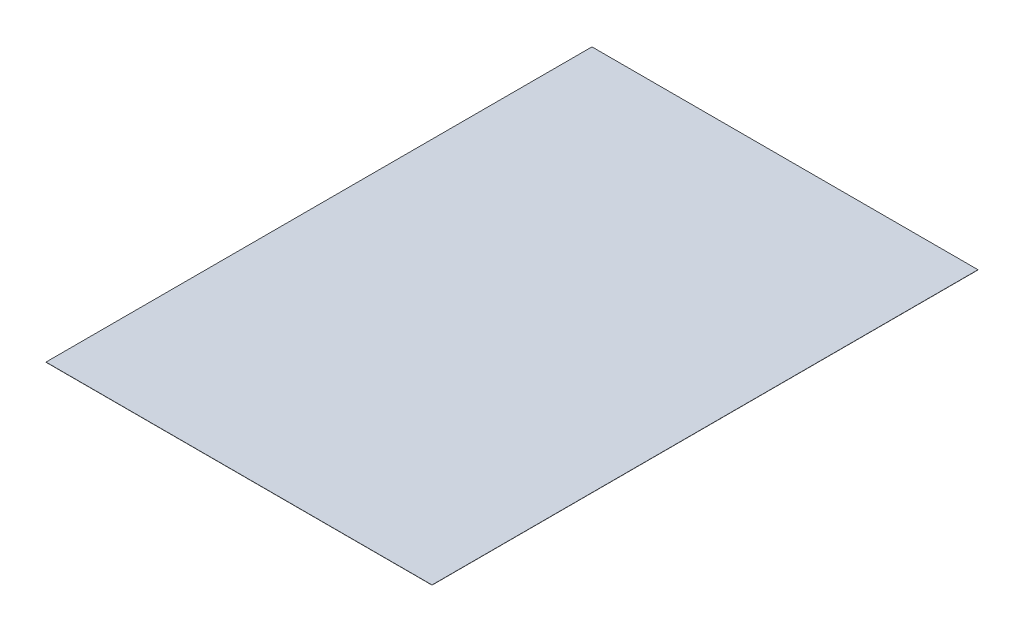
ISO-10303-21;
HEADER;
FILE_DESCRIPTION(('STEP AP214'),'2;1');
FILE_NAME('part.step','',(''),(''),'','','');
FILE_SCHEMA(('AUTOMOTIVE_DESIGN { 1 0 10303 214 1 1 1 1 }'));
ENDSEC;
DATA;
#1=APPLICATION_CONTEXT('core data for automotive mechanical design processes');
#2=APPLICATION_PROTOCOL_DEFINITION('international standard','automotive_design',2000,#1);
#3=PRODUCT_CONTEXT('',#1,'mechanical');
#4=PRODUCT('Part','Part','',(#3));
#5=PRODUCT_RELATED_PRODUCT_CATEGORY('part','',(#4));
#6=PRODUCT_DEFINITION_FORMATION('','',#4);
#7=PRODUCT_DEFINITION_CONTEXT('part definition',#1,'design');
#8=PRODUCT_DEFINITION('design','',#6,#7);
#9=PRODUCT_DEFINITION_SHAPE('','',#8);
#10=(LENGTH_UNIT() NAMED_UNIT(*) SI_UNIT(.MILLI.,.METRE.));
#11=(NAMED_UNIT(*) PLANE_ANGLE_UNIT() SI_UNIT($,.RADIAN.));
#12=(NAMED_UNIT(*) SI_UNIT($,.STERADIAN.) SOLID_ANGLE_UNIT());
#13=UNCERTAINTY_MEASURE_WITH_UNIT(LENGTH_MEASURE(1.E-05),#10,'distance_accuracy_value','');
#14=(GEOMETRIC_REPRESENTATION_CONTEXT(3) GLOBAL_UNCERTAINTY_ASSIGNED_CONTEXT((#13)) GLOBAL_UNIT_ASSIGNED_CONTEXT((#10,
#11,#12)) REPRESENTATION_CONTEXT('',''));
#15=CARTESIAN_POINT('',(0.,0.,0.));
#16=DIRECTION('',(0.,0.,1.));
#17=DIRECTION('',(1.,0.,0.));
#18=AXIS2_PLACEMENT_3D('',#15,#16,#17);
#19=CARTESIAN_POINT('',(0.,0.1,0.));
#20=DIRECTION('',(1.,0.,0.));
#21=DIRECTION('',(0.,0.,-1.));
#22=AXIS2_PLACEMENT_3D('',#19,#20,#21);
#23=PLANE('',#22);
#24=DIRECTION('',(0.,0.,1.));
#25=VECTOR('',#24,1.);
#26=CARTESIAN_POINT('',(0.,0.,0.));
#27=LINE('',#26,#25);
#28=CARTESIAN_POINT('',(0.,0.,-297.));
#29=VERTEX_POINT('',#28);
#30=CARTESIAN_POINT('',(0.,0.,0.));
#31=VERTEX_POINT('',#30);
#32=EDGE_CURVE('E96',#29,#31,#27,.T.);
#33=ORIENTED_EDGE('',*,*,#32,.T.);
#34=DIRECTION('',(0.,-1.,0.));
#35=VECTOR('',#34,1.);
#36=CARTESIAN_POINT('',(0.,0.1,0.));
#37=LINE('',#36,#35);
#38=CARTESIAN_POINT('',(0.,0.1,0.));
#39=VERTEX_POINT('',#38);
#40=EDGE_CURVE('E11',#39,#31,#37,.T.);
#41=ORIENTED_EDGE('',*,*,#40,.F.);
#42=DIRECTION('',(0.,0.,1.));
#43=VECTOR('',#42,1.);
#44=CARTESIAN_POINT('',(0.,0.1,0.));
#45=LINE('',#44,#43);
#46=CARTESIAN_POINT('',(0.,0.1,-297.));
#47=VERTEX_POINT('',#46);
#48=EDGE_CURVE('E84',#47,#39,#45,.T.);
#49=ORIENTED_EDGE('',*,*,#48,.F.);
#50=DIRECTION('',(0.,-1.,0.));
#51=VECTOR('',#50,1.);
#52=CARTESIAN_POINT('',(0.,0.1,-297.));
#53=LINE('',#52,#51);
#54=EDGE_CURVE('E92',#47,#29,#53,.T.);
#55=ORIENTED_EDGE('',*,*,#54,.T.);
#56=EDGE_LOOP('',(#33,#41,#49,#55));
#57=FACE_BOUND('',#56,.T.);
#58=ADVANCED_FACE('F33',(#57),#23,.F.);
#59=CARTESIAN_POINT('',(0.,0.1,0.));
#60=DIRECTION('',(0.,0.,-1.));
#61=DIRECTION('',(-1.,0.,0.));
#62=AXIS2_PLACEMENT_3D('',#59,#60,#61);
#63=PLANE('',#62);
#64=DIRECTION('',(1.,0.,0.));
#65=VECTOR('',#64,1.);
#66=CARTESIAN_POINT('',(0.,0.,0.));
#67=LINE('',#66,#65);
#68=CARTESIAN_POINT('',(210.,0.,0.));
#69=VERTEX_POINT('',#68);
#70=EDGE_CURVE('E88',#31,#69,#67,.T.);
#71=ORIENTED_EDGE('',*,*,#70,.T.);
#72=DIRECTION('',(0.,-1.,0.));
#73=VECTOR('',#72,1.);
#74=CARTESIAN_POINT('',(210.,0.1,0.));
#75=LINE('',#74,#73);
#76=CARTESIAN_POINT('',(210.,0.1,0.));
#77=VERTEX_POINT('',#76);
#78=EDGE_CURVE('E41',#77,#69,#75,.T.);
#79=ORIENTED_EDGE('',*,*,#78,.F.);
#80=DIRECTION('',(1.,0.,0.));
#81=VECTOR('',#80,1.);
#82=CARTESIAN_POINT('',(0.,0.1,0.));
#83=LINE('',#82,#81);
#84=EDGE_CURVE('E79',#39,#77,#83,.T.);
#85=ORIENTED_EDGE('',*,*,#84,.F.);
#86=ORIENTED_EDGE('',*,*,#40,.T.);
#87=EDGE_LOOP('',(#71,#79,#85,#86));
#88=FACE_BOUND('',#87,.T.);
#89=ADVANCED_FACE('F87',(#88),#63,.F.);
#90=CARTESIAN_POINT('',(210.,0.1,0.));
#91=DIRECTION('',(-1.,0.,0.));
#92=DIRECTION('',(0.,0.,1.));
#93=AXIS2_PLACEMENT_3D('',#90,#91,#92);
#94=PLANE('',#93);
#95=DIRECTION('',(0.,0.,-1.));
#96=VECTOR('',#95,1.);
#97=CARTESIAN_POINT('',(210.,0.,0.));
#98=LINE('',#97,#96);
#99=CARTESIAN_POINT('',(210.,0.,-297.));
#100=VERTEX_POINT('',#99);
#101=EDGE_CURVE('E66',#69,#100,#98,.T.);
#102=ORIENTED_EDGE('',*,*,#101,.T.);
#103=DIRECTION('',(0.,-1.,0.));
#104=VECTOR('',#103,1.);
#105=CARTESIAN_POINT('',(210.,0.1,-297.));
#106=LINE('',#105,#104);
#107=CARTESIAN_POINT('',(210.,0.1,-297.));
#108=VERTEX_POINT('',#107);
#109=EDGE_CURVE('E89',#108,#100,#106,.T.);
#110=ORIENTED_EDGE('',*,*,#109,.F.);
#111=DIRECTION('',(0.,0.,-1.));
#112=VECTOR('',#111,1.);
#113=CARTESIAN_POINT('',(210.,0.1,0.));
#114=LINE('',#113,#112);
#115=EDGE_CURVE('E82',#77,#108,#114,.T.);
#116=ORIENTED_EDGE('',*,*,#115,.F.);
#117=ORIENTED_EDGE('',*,*,#78,.T.);
#118=EDGE_LOOP('',(#102,#110,#116,#117));
#119=FACE_BOUND('',#118,.T.);
#120=ADVANCED_FACE('F90',(#119),#94,.F.);
#121=CARTESIAN_POINT('',(0.,0.1,-297.));
#122=DIRECTION('',(0.,0.,1.));
#123=DIRECTION('',(1.,0.,0.));
#124=AXIS2_PLACEMENT_3D('',#121,#122,#123);
#125=PLANE('',#124);
#126=DIRECTION('',(-1.,0.,0.));
#127=VECTOR('',#126,1.);
#128=CARTESIAN_POINT('',(0.,0.,-297.));
#129=LINE('',#128,#127);
#130=EDGE_CURVE('E72',#100,#29,#129,.T.);
#131=ORIENTED_EDGE('',*,*,#130,.T.);
#132=ORIENTED_EDGE('',*,*,#54,.F.);
#133=DIRECTION('',(-1.,0.,0.));
#134=VECTOR('',#133,1.);
#135=CARTESIAN_POINT('',(0.,0.1,-297.));
#136=LINE('',#135,#134);
#137=EDGE_CURVE('E49',#108,#47,#136,.T.);
#138=ORIENTED_EDGE('',*,*,#137,.F.);
#139=ORIENTED_EDGE('',*,*,#109,.T.);
#140=EDGE_LOOP('',(#131,#132,#138,#139));
#141=FACE_BOUND('',#140,.T.);
#142=ADVANCED_FACE('F103',(#141),#125,.F.);
#143=CARTESIAN_POINT('',(0.,0.1,0.));
#144=DIRECTION('',(0.,-1.,0.));
#145=DIRECTION('',(0.,0.,-1.));
#146=AXIS2_PLACEMENT_3D('',#143,#144,#145);
#147=PLANE('',#146);
#148=ORIENTED_EDGE('',*,*,#48,.T.);
#149=ORIENTED_EDGE('',*,*,#84,.T.);
#150=ORIENTED_EDGE('',*,*,#115,.T.);
#151=ORIENTED_EDGE('',*,*,#137,.T.);
#152=EDGE_LOOP('',(#148,#149,#150,#151));
#153=FACE_BOUND('',#152,.T.);
#154=ADVANCED_FACE('F80',(#153),#147,.F.);
#155=CARTESIAN_POINT('',(0.,0.,0.));
#156=DIRECTION('',(0.,-1.,0.));
#157=DIRECTION('',(0.,0.,-1.));
#158=AXIS2_PLACEMENT_3D('',#155,#156,#157);
#159=PLANE('',#158);
#160=ORIENTED_EDGE('',*,*,#32,.F.);
#161=ORIENTED_EDGE('',*,*,#130,.F.);
#162=ORIENTED_EDGE('',*,*,#101,.F.);
#163=ORIENTED_EDGE('',*,*,#70,.F.);
#164=EDGE_LOOP('',(#160,#161,#162,#163));
#165=FACE_BOUND('',#164,.T.);
#166=ADVANCED_FACE('F106',(#165),#159,.T.);
#167=CLOSED_SHELL('',(#58,#89,#120,#142,#154,#166));
#168=MANIFOLD_SOLID_BREP('B2',#167);
#169=ADVANCED_BREP_SHAPE_REPRESENTATION('',(#18,#168),#14);
#170=SHAPE_DEFINITION_REPRESENTATION(#9,#169);
ENDSEC;
END-ISO-10303-21;
